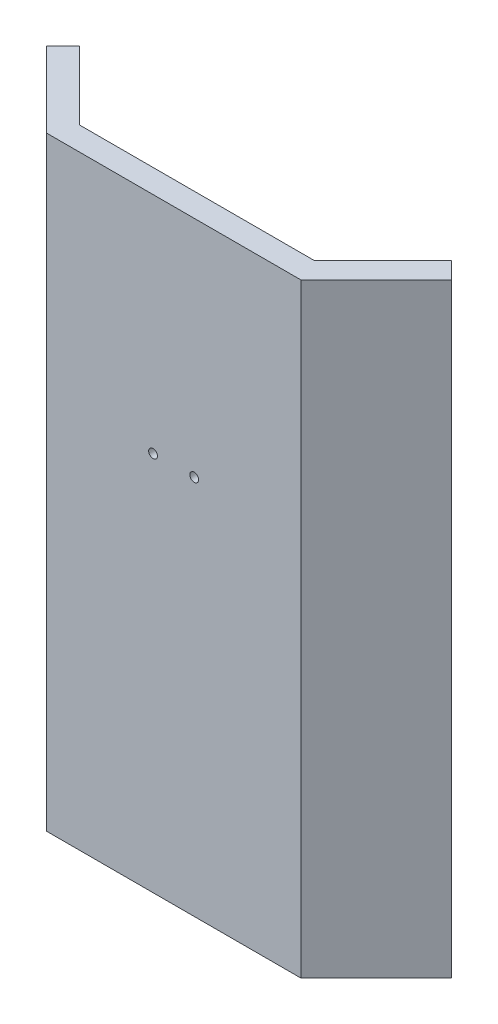
ISO-10303-21;
HEADER;
FILE_DESCRIPTION(('STEP AP214'),'2;1');
FILE_NAME('part.step','',(''),(''),'','','');
FILE_SCHEMA(('AUTOMOTIVE_DESIGN { 1 0 10303 214 1 1 1 1 }'));
ENDSEC;
DATA;
#1=APPLICATION_CONTEXT('core data for automotive mechanical design processes');
#2=APPLICATION_PROTOCOL_DEFINITION('international standard','automotive_design',2000,#1);
#3=PRODUCT_CONTEXT('',#1,'mechanical');
#4=PRODUCT('Part','Part','',(#3));
#5=PRODUCT_RELATED_PRODUCT_CATEGORY('part','',(#4));
#6=PRODUCT_DEFINITION_FORMATION('','',#4);
#7=PRODUCT_DEFINITION_CONTEXT('part definition',#1,'design');
#8=PRODUCT_DEFINITION('design','',#6,#7);
#9=PRODUCT_DEFINITION_SHAPE('','',#8);
#10=(LENGTH_UNIT() NAMED_UNIT(*) SI_UNIT(.MILLI.,.METRE.));
#11=(NAMED_UNIT(*) PLANE_ANGLE_UNIT() SI_UNIT($,.RADIAN.));
#12=(NAMED_UNIT(*) SI_UNIT($,.STERADIAN.) SOLID_ANGLE_UNIT());
#13=UNCERTAINTY_MEASURE_WITH_UNIT(LENGTH_MEASURE(1.E-05),#10,'distance_accuracy_value','');
#14=(GEOMETRIC_REPRESENTATION_CONTEXT(3) GLOBAL_UNCERTAINTY_ASSIGNED_CONTEXT((#13)) GLOBAL_UNIT_ASSIGNED_CONTEXT((#10,
#11,#12)) REPRESENTATION_CONTEXT('',''));
#15=CARTESIAN_POINT('',(0.,0.,0.));
#16=DIRECTION('',(0.,0.,1.));
#17=DIRECTION('',(1.,0.,0.));
#18=AXIS2_PLACEMENT_3D('',#15,#16,#17);
#19=CARTESIAN_POINT('',(-40.,206.,0.));
#20=DIRECTION('',(0.,0.,-1.));
#21=DIRECTION('',(-1.,0.,0.));
#22=AXIS2_PLACEMENT_3D('',#19,#20,#21);
#23=PLANE('',#22);
#24=CARTESIAN_POINT('',(6.99993142890758,129.596,0.));
#25=DIRECTION('',(0.,0.,-1.));
#26=DIRECTION('',(-1.,0.,0.));
#27=AXIS2_PLACEMENT_3D('',#24,#25,#26);
#28=CIRCLE('',#27,1.5);
#29=CARTESIAN_POINT('',(5.49993142890758,129.596,0.));
#30=VERTEX_POINT('',#29);
#31=EDGE_CURVE('E518',#30,#30,#28,.T.);
#32=ORIENTED_EDGE('',*,*,#31,.F.);
#33=EDGE_LOOP('',(#32));
#34=FACE_BOUND('',#33,.T.);
#35=CARTESIAN_POINT('',(-7.00006857109242,129.596,0.));
#36=DIRECTION('',(0.,0.,-1.));
#37=DIRECTION('',(-1.,0.,0.));
#38=AXIS2_PLACEMENT_3D('',#35,#36,#37);
#39=CIRCLE('',#38,1.5);
#40=CARTESIAN_POINT('',(-8.50006857109242,129.596,0.));
#41=VERTEX_POINT('',#40);
#42=EDGE_CURVE('E521',#41,#41,#39,.T.);
#43=ORIENTED_EDGE('',*,*,#42,.F.);
#44=EDGE_LOOP('',(#43));
#45=FACE_BOUND('',#44,.T.);
#46=DIRECTION('',(1.,0.,0.));
#47=VECTOR('',#46,1.);
#48=CARTESIAN_POINT('',(-40.,0.,0.));
#49=LINE('',#48,#47);
#50=CARTESIAN_POINT('',(-40.,0.,0.));
#51=VERTEX_POINT('',#50);
#52=CARTESIAN_POINT('',(40.,0.,0.));
#53=VERTEX_POINT('',#52);
#54=EDGE_CURVE('E235',#51,#53,#49,.T.);
#55=ORIENTED_EDGE('',*,*,#54,.F.);
#56=DIRECTION('',(0.,-1.,0.));
#57=VECTOR('',#56,1.);
#58=CARTESIAN_POINT('',(-40.,206.,0.));
#59=LINE('',#58,#57);
#60=CARTESIAN_POINT('',(-40.,206.,0.));
#61=VERTEX_POINT('',#60);
#62=EDGE_CURVE('E256',#61,#51,#59,.T.);
#63=ORIENTED_EDGE('',*,*,#62,.F.);
#64=DIRECTION('',(1.,0.,0.));
#65=VECTOR('',#64,1.);
#66=CARTESIAN_POINT('',(-40.,206.,0.));
#67=LINE('',#66,#65);
#68=CARTESIAN_POINT('',(40.,206.,0.));
#69=VERTEX_POINT('',#68);
#70=EDGE_CURVE('E213',#61,#69,#67,.T.);
#71=ORIENTED_EDGE('',*,*,#70,.T.);
#72=DIRECTION('',(0.,-1.,0.));
#73=VECTOR('',#72,1.);
#74=CARTESIAN_POINT('',(40.,206.,0.));
#75=LINE('',#74,#73);
#76=EDGE_CURVE('E254',#69,#53,#75,.T.);
#77=ORIENTED_EDGE('',*,*,#76,.T.);
#78=EDGE_LOOP('',(#55,#63,#71,#77));
#79=FACE_BOUND('',#78,.T.);
#80=DIRECTION('',(-1.,0.,0.));
#81=VECTOR('',#80,1.);
#82=CARTESIAN_POINT('',(34.,6.40410699156168,0.));
#83=LINE('',#82,#81);
#84=CARTESIAN_POINT('',(34.,6.40410699156168,0.));
#85=VERTEX_POINT('',#84);
#86=CARTESIAN_POINT('',(24.,6.40410699156168,0.));
#87=VERTEX_POINT('',#86);
#88=EDGE_CURVE('E175',#85,#87,#83,.T.);
#89=ORIENTED_EDGE('',*,*,#88,.F.);
#90=DIRECTION('',(0.,-1.,0.));
#91=VECTOR('',#90,1.);
#92=CARTESIAN_POINT('',(34.,6.40410699156168,0.));
#93=LINE('',#92,#91);
#94=CARTESIAN_POINT('',(34.,12.4041069915617,0.));
#95=VERTEX_POINT('',#94);
#96=EDGE_CURVE('E172',#95,#85,#93,.T.);
#97=ORIENTED_EDGE('',*,*,#96,.F.);
#98=DIRECTION('',(1.,0.,0.));
#99=VECTOR('',#98,1.);
#100=CARTESIAN_POINT('',(34.,12.4041069915617,0.));
#101=LINE('',#100,#99);
#102=CARTESIAN_POINT('',(24.,12.4041069915617,0.));
#103=VERTEX_POINT('',#102);
#104=EDGE_CURVE('E184',#103,#95,#101,.T.);
#105=ORIENTED_EDGE('',*,*,#104,.F.);
#106=DIRECTION('',(0.,1.,0.));
#107=VECTOR('',#106,1.);
#108=CARTESIAN_POINT('',(24.,6.40410699156168,0.));
#109=LINE('',#108,#107);
#110=EDGE_CURVE('E192',#87,#103,#109,.T.);
#111=ORIENTED_EDGE('',*,*,#110,.F.);
#112=EDGE_LOOP('',(#89,#97,#105,#111));
#113=FACE_BOUND('',#112,.T.);
#114=DIRECTION('',(0.,1.,0.));
#115=VECTOR('',#114,1.);
#116=CARTESIAN_POINT('',(-34.,6.40410699156168,0.));
#117=LINE('',#116,#115);
#118=CARTESIAN_POINT('',(-34.,6.40410699156168,0.));
#119=VERTEX_POINT('',#118);
#120=CARTESIAN_POINT('',(-34.,12.4041069915617,0.));
#121=VERTEX_POINT('',#120);
#122=EDGE_CURVE('E265',#119,#121,#117,.T.);
#123=ORIENTED_EDGE('',*,*,#122,.F.);
#124=DIRECTION('',(-1.,0.,0.));
#125=VECTOR('',#124,1.);
#126=CARTESIAN_POINT('',(-34.,6.40410699156168,0.));
#127=LINE('',#126,#125);
#128=CARTESIAN_POINT('',(-24.,6.40410699156168,0.));
#129=VERTEX_POINT('',#128);
#130=EDGE_CURVE('E170',#129,#119,#127,.T.);
#131=ORIENTED_EDGE('',*,*,#130,.F.);
#132=DIRECTION('',(0.,-1.,0.));
#133=VECTOR('',#132,1.);
#134=CARTESIAN_POINT('',(-24.,6.40410699156168,0.));
#135=LINE('',#134,#133);
#136=CARTESIAN_POINT('',(-24.,12.4041069915617,0.));
#137=VERTEX_POINT('',#136);
#138=EDGE_CURVE('E166',#137,#129,#135,.T.);
#139=ORIENTED_EDGE('',*,*,#138,.F.);
#140=DIRECTION('',(1.,0.,0.));
#141=VECTOR('',#140,1.);
#142=CARTESIAN_POINT('',(-34.,12.4041069915617,0.));
#143=LINE('',#142,#141);
#144=EDGE_CURVE('E280',#121,#137,#143,.T.);
#145=ORIENTED_EDGE('',*,*,#144,.F.);
#146=EDGE_LOOP('',(#123,#131,#139,#145));
#147=FACE_BOUND('',#146,.T.);
#148=ADVANCED_FACE('F32',(#34,#45,#79,#113,#147),#23,.T.);
#149=CARTESIAN_POINT('',(-43.3137084989847,206.,8.));
#150=DIRECTION('',(-0.707106781186544,0.,0.707106781186551));
#151=DIRECTION('',(0.707106781186551,0.,0.707106781186544));
#152=AXIS2_PLACEMENT_3D('',#149,#150,#151);
#153=PLANE('',#152);
#154=DIRECTION('',(-0.707106781186551,0.,-0.707106781186544));
#155=VECTOR('',#154,1.);
#156=CARTESIAN_POINT('',(-43.3137084989847,0.,8.));
#157=LINE('',#156,#155);
#158=CARTESIAN_POINT('',(-43.3137084989847,0.,8.));
#159=VERTEX_POINT('',#158);
#160=CARTESIAN_POINT('',(-68.9913780286486,0.,-17.6776695296635));
#161=VERTEX_POINT('',#160);
#162=EDGE_CURVE('E203',#159,#161,#157,.T.);
#163=ORIENTED_EDGE('',*,*,#162,.F.);
#164=DIRECTION('',(0.,-1.,0.));
#165=VECTOR('',#164,1.);
#166=CARTESIAN_POINT('',(-43.3137084989847,206.,8.));
#167=LINE('',#166,#165);
#168=CARTESIAN_POINT('',(-43.3137084989847,206.,8.));
#169=VERTEX_POINT('',#168);
#170=EDGE_CURVE('E11',#169,#159,#167,.T.);
#171=ORIENTED_EDGE('',*,*,#170,.F.);
#172=DIRECTION('',(-0.707106781186551,0.,-0.707106781186544));
#173=VECTOR('',#172,1.);
#174=CARTESIAN_POINT('',(-43.3137084989847,206.,8.));
#175=LINE('',#174,#173);
#176=CARTESIAN_POINT('',(-68.9913780286486,206.,-17.6776695296635));
#177=VERTEX_POINT('',#176);
#178=EDGE_CURVE('E204',#169,#177,#175,.T.);
#179=ORIENTED_EDGE('',*,*,#178,.T.);
#180=DIRECTION('',(0.,-1.,0.));
#181=VECTOR('',#180,1.);
#182=CARTESIAN_POINT('',(-68.9913780286486,206.,-17.6776695296635));
#183=LINE('',#182,#181);
#184=EDGE_CURVE('E226',#177,#161,#183,.T.);
#185=ORIENTED_EDGE('',*,*,#184,.T.);
#186=EDGE_LOOP('',(#163,#171,#179,#185));
#187=FACE_BOUND('',#186,.T.);
#188=ADVANCED_FACE('F34',(#187),#153,.T.);
#189=CARTESIAN_POINT('',(-43.3137084989847,206.,8.));
#190=DIRECTION('',(0.,0.,-1.));
#191=DIRECTION('',(-1.,0.,0.));
#192=AXIS2_PLACEMENT_3D('',#189,#190,#191);
#193=PLANE('',#192);
#194=CARTESIAN_POINT('',(6.99993142890758,129.596,8.));
#195=DIRECTION('',(0.,0.,1.));
#196=DIRECTION('',(1.,0.,0.));
#197=AXIS2_PLACEMENT_3D('',#194,#195,#196);
#198=CIRCLE('',#197,1.5);
#199=CARTESIAN_POINT('',(8.49993142890758,129.596,8.));
#200=VERTEX_POINT('',#199);
#201=EDGE_CURVE('E520',#200,#200,#198,.T.);
#202=ORIENTED_EDGE('',*,*,#201,.F.);
#203=EDGE_LOOP('',(#202));
#204=FACE_BOUND('',#203,.T.);
#205=CARTESIAN_POINT('',(-7.00006857109242,129.596,8.));
#206=DIRECTION('',(0.,0.,1.));
#207=DIRECTION('',(1.,0.,0.));
#208=AXIS2_PLACEMENT_3D('',#205,#206,#207);
#209=CIRCLE('',#208,1.5);
#210=CARTESIAN_POINT('',(-5.50006857109242,129.596,8.));
#211=VERTEX_POINT('',#210);
#212=EDGE_CURVE('E522',#211,#211,#209,.T.);
#213=ORIENTED_EDGE('',*,*,#212,.F.);
#214=EDGE_LOOP('',(#213));
#215=FACE_BOUND('',#214,.T.);
#216=DIRECTION('',(1.,0.,0.));
#217=VECTOR('',#216,1.);
#218=CARTESIAN_POINT('',(-43.3137084989847,0.,8.));
#219=LINE('',#218,#217);
#220=CARTESIAN_POINT('',(43.3137084989848,0.,8.));
#221=VERTEX_POINT('',#220);
#222=EDGE_CURVE('E208',#159,#221,#219,.T.);
#223=ORIENTED_EDGE('',*,*,#222,.T.);
#224=DIRECTION('',(0.,-1.,0.));
#225=VECTOR('',#224,1.);
#226=CARTESIAN_POINT('',(43.3137084989848,206.,8.));
#227=LINE('',#226,#225);
#228=CARTESIAN_POINT('',(43.3137084989848,206.,8.));
#229=VERTEX_POINT('',#228);
#230=EDGE_CURVE('E41',#229,#221,#227,.T.);
#231=ORIENTED_EDGE('',*,*,#230,.F.);
#232=DIRECTION('',(1.,0.,0.));
#233=VECTOR('',#232,1.);
#234=CARTESIAN_POINT('',(-43.3137084989847,206.,8.));
#235=LINE('',#234,#233);
#236=EDGE_CURVE('E224',#169,#229,#235,.T.);
#237=ORIENTED_EDGE('',*,*,#236,.F.);
#238=ORIENTED_EDGE('',*,*,#170,.T.);
#239=EDGE_LOOP('',(#223,#231,#237,#238));
#240=FACE_BOUND('',#239,.T.);
#241=ADVANCED_FACE('F306',(#204,#215,#240),#193,.F.);
#242=CARTESIAN_POINT('',(43.3137084989848,206.,8.));
#243=DIRECTION('',(-0.707106781186548,0.,-0.707106781186548));
#244=DIRECTION('',(-0.707106781186548,0.,0.707106781186548));
#245=AXIS2_PLACEMENT_3D('',#242,#243,#244);
#246=PLANE('',#245);
#247=DIRECTION('',(0.707106781186548,0.,-0.707106781186548));
#248=VECTOR('',#247,1.);
#249=CARTESIAN_POINT('',(43.3137084989848,0.,8.));
#250=LINE('',#249,#248);
#251=CARTESIAN_POINT('',(68.9913780286485,0.,-17.6776695296637));
#252=VERTEX_POINT('',#251);
#253=EDGE_CURVE('E244',#221,#252,#250,.T.);
#254=ORIENTED_EDGE('',*,*,#253,.T.);
#255=DIRECTION('',(0.,-1.,0.));
#256=VECTOR('',#255,1.);
#257=CARTESIAN_POINT('',(68.9913780286485,206.,-17.6776695296637));
#258=LINE('',#257,#256);
#259=CARTESIAN_POINT('',(68.9913780286485,206.,-17.6776695296637));
#260=VERTEX_POINT('',#259);
#261=EDGE_CURVE('E250',#260,#252,#258,.T.);
#262=ORIENTED_EDGE('',*,*,#261,.F.);
#263=DIRECTION('',(0.707106781186548,0.,-0.707106781186548));
#264=VECTOR('',#263,1.);
#265=CARTESIAN_POINT('',(43.3137084989848,206.,8.));
#266=LINE('',#265,#264);
#267=EDGE_CURVE('E222',#229,#260,#266,.T.);
#268=ORIENTED_EDGE('',*,*,#267,.F.);
#269=ORIENTED_EDGE('',*,*,#230,.T.);
#270=EDGE_LOOP('',(#254,#262,#268,#269));
#271=FACE_BOUND('',#270,.T.);
#272=ADVANCED_FACE('F353',(#271),#246,.F.);
#273=CARTESIAN_POINT('',(63.3345237791561,206.,-23.3345237791561));
#274=DIRECTION('',(0.707106781186546,0.,-0.707106781186549));
#275=DIRECTION('',(-0.707106781186549,0.,-0.707106781186546));
#276=AXIS2_PLACEMENT_3D('',#273,#274,#275);
#277=PLANE('',#276);
#278=DIRECTION('',(0.707106781186549,0.,0.707106781186546));
#279=VECTOR('',#278,1.);
#280=CARTESIAN_POINT('',(63.3345237791561,0.,-23.3345237791561));
#281=LINE('',#280,#279);
#282=CARTESIAN_POINT('',(63.3345237791561,0.,-23.3345237791561));
#283=VERTEX_POINT('',#282);
#284=EDGE_CURVE('E241',#283,#252,#281,.T.);
#285=ORIENTED_EDGE('',*,*,#284,.F.);
#286=DIRECTION('',(0.,-1.,0.));
#287=VECTOR('',#286,1.);
#288=CARTESIAN_POINT('',(63.3345237791561,206.,-23.3345237791561));
#289=LINE('',#288,#287);
#290=CARTESIAN_POINT('',(63.3345237791561,206.,-23.3345237791561));
#291=VERTEX_POINT('',#290);
#292=EDGE_CURVE('E252',#291,#283,#289,.T.);
#293=ORIENTED_EDGE('',*,*,#292,.F.);
#294=DIRECTION('',(0.707106781186549,0.,0.707106781186546));
#295=VECTOR('',#294,1.);
#296=CARTESIAN_POINT('',(63.3345237791561,206.,-23.3345237791561));
#297=LINE('',#296,#295);
#298=EDGE_CURVE('E219',#291,#260,#297,.T.);
#299=ORIENTED_EDGE('',*,*,#298,.T.);
#300=ORIENTED_EDGE('',*,*,#261,.T.);
#301=EDGE_LOOP('',(#285,#293,#299,#300));
#302=FACE_BOUND('',#301,.T.);
#303=ADVANCED_FACE('F348',(#302),#277,.T.);
#304=CARTESIAN_POINT('',(40.,206.,0.));
#305=DIRECTION('',(-0.707106781186547,0.,-0.707106781186548));
#306=DIRECTION('',(-0.707106781186548,0.,0.707106781186547));
#307=AXIS2_PLACEMENT_3D('',#304,#305,#306);
#308=PLANE('',#307);
#309=DIRECTION('',(0.707106781186548,0.,-0.707106781186547));
#310=VECTOR('',#309,1.);
#311=CARTESIAN_POINT('',(40.,0.,0.));
#312=LINE('',#311,#310);
#313=EDGE_CURVE('E238',#53,#283,#312,.T.);
#314=ORIENTED_EDGE('',*,*,#313,.F.);
#315=ORIENTED_EDGE('',*,*,#76,.F.);
#316=DIRECTION('',(0.707106781186548,0.,-0.707106781186547));
#317=VECTOR('',#316,1.);
#318=CARTESIAN_POINT('',(40.,206.,0.));
#319=LINE('',#318,#317);
#320=EDGE_CURVE('E216',#69,#291,#319,.T.);
#321=ORIENTED_EDGE('',*,*,#320,.T.);
#322=ORIENTED_EDGE('',*,*,#292,.T.);
#323=EDGE_LOOP('',(#314,#315,#321,#322));
#324=FACE_BOUND('',#323,.T.);
#325=ADVANCED_FACE('F312',(#324),#308,.T.);
#326=CARTESIAN_POINT('',(-40.,206.,0.));
#327=DIRECTION('',(-0.707106781186544,0.,0.707106781186551));
#328=DIRECTION('',(0.707106781186551,0.,0.707106781186544));
#329=AXIS2_PLACEMENT_3D('',#326,#327,#328);
#330=PLANE('',#329);
#331=DIRECTION('',(-0.707106781186551,0.,-0.707106781186544));
#332=VECTOR('',#331,1.);
#333=CARTESIAN_POINT('',(-40.,0.,0.));
#334=LINE('',#333,#332);
#335=CARTESIAN_POINT('',(-63.3345237791562,0.,-23.3345237791559));
#336=VERTEX_POINT('',#335);
#337=EDGE_CURVE('E232',#51,#336,#334,.T.);
#338=ORIENTED_EDGE('',*,*,#337,.T.);
#339=DIRECTION('',(0.,-1.,0.));
#340=VECTOR('',#339,1.);
#341=CARTESIAN_POINT('',(-63.3345237791562,206.,-23.3345237791559));
#342=LINE('',#341,#340);
#343=CARTESIAN_POINT('',(-63.3345237791562,206.,-23.3345237791559));
#344=VERTEX_POINT('',#343);
#345=EDGE_CURVE('E258',#344,#336,#342,.T.);
#346=ORIENTED_EDGE('',*,*,#345,.F.);
#347=DIRECTION('',(-0.707106781186551,0.,-0.707106781186544));
#348=VECTOR('',#347,1.);
#349=CARTESIAN_POINT('',(-40.,206.,0.));
#350=LINE('',#349,#348);
#351=EDGE_CURVE('E211',#61,#344,#350,.T.);
#352=ORIENTED_EDGE('',*,*,#351,.F.);
#353=ORIENTED_EDGE('',*,*,#62,.T.);
#354=EDGE_LOOP('',(#338,#346,#352,#353));
#355=FACE_BOUND('',#354,.T.);
#356=ADVANCED_FACE('F314',(#355),#330,.F.);
#357=CARTESIAN_POINT('',(-68.9913780286486,206.,-17.6776695296635));
#358=DIRECTION('',(-0.707106781186551,0.,-0.707106781186543));
#359=DIRECTION('',(-0.707106781186544,0.,0.707106781186552));
#360=AXIS2_PLACEMENT_3D('',#357,#358,#359);
#361=PLANE('',#360);
#362=DIRECTION('',(0.707106781186544,0.,-0.707106781186551));
#363=VECTOR('',#362,1.);
#364=CARTESIAN_POINT('',(-68.9913780286486,0.,-17.6776695296635));
#365=LINE('',#364,#363);
#366=EDGE_CURVE('E229',#161,#336,#365,.T.);
#367=ORIENTED_EDGE('',*,*,#366,.F.);
#368=ORIENTED_EDGE('',*,*,#184,.F.);
#369=DIRECTION('',(0.707106781186544,0.,-0.707106781186551));
#370=VECTOR('',#369,1.);
#371=CARTESIAN_POINT('',(-68.9913780286486,206.,-17.6776695296635));
#372=LINE('',#371,#370);
#373=EDGE_CURVE('E207',#177,#344,#372,.T.);
#374=ORIENTED_EDGE('',*,*,#373,.T.);
#375=ORIENTED_EDGE('',*,*,#345,.T.);
#376=EDGE_LOOP('',(#367,#368,#374,#375));
#377=FACE_BOUND('',#376,.T.);
#378=ADVANCED_FACE('F316',(#377),#361,.T.);
#379=CARTESIAN_POINT('',(0.,206.,0.));
#380=DIRECTION('',(0.,-1.,0.));
#381=DIRECTION('',(0.,0.,-1.));
#382=AXIS2_PLACEMENT_3D('',#379,#380,#381);
#383=PLANE('',#382);
#384=ORIENTED_EDGE('',*,*,#178,.F.);
#385=ORIENTED_EDGE('',*,*,#236,.T.);
#386=ORIENTED_EDGE('',*,*,#267,.T.);
#387=ORIENTED_EDGE('',*,*,#298,.F.);
#388=ORIENTED_EDGE('',*,*,#320,.F.);
#389=ORIENTED_EDGE('',*,*,#70,.F.);
#390=ORIENTED_EDGE('',*,*,#351,.T.);
#391=ORIENTED_EDGE('',*,*,#373,.F.);
#392=EDGE_LOOP('',(#384,#385,#386,#387,#388,#389,#390,#391));
#393=FACE_BOUND('',#392,.T.);
#394=ADVANCED_FACE('F319',(#393),#383,.F.);
#395=CARTESIAN_POINT('',(0.,0.,0.));
#396=DIRECTION('',(0.,-1.,0.));
#397=DIRECTION('',(0.,0.,-1.));
#398=AXIS2_PLACEMENT_3D('',#395,#396,#397);
#399=PLANE('',#398);
#400=ORIENTED_EDGE('',*,*,#162,.T.);
#401=ORIENTED_EDGE('',*,*,#366,.T.);
#402=ORIENTED_EDGE('',*,*,#337,.F.);
#403=ORIENTED_EDGE('',*,*,#54,.T.);
#404=ORIENTED_EDGE('',*,*,#313,.T.);
#405=ORIENTED_EDGE('',*,*,#284,.T.);
#406=ORIENTED_EDGE('',*,*,#253,.F.);
#407=ORIENTED_EDGE('',*,*,#222,.F.);
#408=EDGE_LOOP('',(#400,#401,#402,#403,#404,#405,#406,#407));
#409=FACE_BOUND('',#408,.T.);
#410=ADVANCED_FACE('F324',(#409),#399,.T.);
#411=CARTESIAN_POINT('',(34.,6.40410699156168,-10.));
#412=DIRECTION('',(-1.,0.,0.));
#413=DIRECTION('',(0.,0.,1.));
#414=AXIS2_PLACEMENT_3D('',#411,#412,#413);
#415=PLANE('',#414);
#416=ORIENTED_EDGE('',*,*,#96,.T.);
#417=DIRECTION('',(0.,0.,1.));
#418=VECTOR('',#417,1.);
#419=CARTESIAN_POINT('',(34.,6.40410699156168,-10.));
#420=LINE('',#419,#418);
#421=CARTESIAN_POINT('',(34.,6.40410699156168,-10.));
#422=VERTEX_POINT('',#421);
#423=EDGE_CURVE('E201',#422,#85,#420,.T.);
#424=ORIENTED_EDGE('',*,*,#423,.F.);
#425=DIRECTION('',(0.,-1.,0.));
#426=VECTOR('',#425,1.);
#427=CARTESIAN_POINT('',(34.,6.40410699156168,-10.));
#428=LINE('',#427,#426);
#429=CARTESIAN_POINT('',(34.,12.4041069915617,-10.));
#430=VERTEX_POINT('',#429);
#431=EDGE_CURVE('E180',#430,#422,#428,.T.);
#432=ORIENTED_EDGE('',*,*,#431,.F.);
#433=DIRECTION('',(0.,0.,1.));
#434=VECTOR('',#433,1.);
#435=CARTESIAN_POINT('',(34.,12.4041069915617,-10.));
#436=LINE('',#435,#434);
#437=EDGE_CURVE('E189',#430,#95,#436,.T.);
#438=ORIENTED_EDGE('',*,*,#437,.T.);
#439=EDGE_LOOP('',(#416,#424,#432,#438));
#440=FACE_BOUND('',#439,.T.);
#441=ADVANCED_FACE('F394',(#440),#415,.F.);
#442=CARTESIAN_POINT('',(34.,6.40410699156168,-10.));
#443=DIRECTION('',(0.,1.,0.));
#444=DIRECTION('',(0.,0.,1.));
#445=AXIS2_PLACEMENT_3D('',#442,#443,#444);
#446=PLANE('',#445);
#447=CARTESIAN_POINT('',(29.,6.40410699156168,-5.));
#448=DIRECTION('',(0.,-1.,0.));
#449=DIRECTION('',(0.,0.,-1.));
#450=AXIS2_PLACEMENT_3D('',#447,#448,#449);
#451=CIRCLE('',#450,1.5);
#452=CARTESIAN_POINT('',(29.,6.40410699156168,-6.5));
#453=VERTEX_POINT('',#452);
#454=EDGE_CURVE('E272',#453,#453,#451,.T.);
#455=ORIENTED_EDGE('',*,*,#454,.F.);
#456=EDGE_LOOP('',(#455));
#457=FACE_BOUND('',#456,.T.);
#458=ORIENTED_EDGE('',*,*,#88,.T.);
#459=DIRECTION('',(0.,0.,1.));
#460=VECTOR('',#459,1.);
#461=CARTESIAN_POINT('',(24.,6.40410699156168,-10.));
#462=LINE('',#461,#460);
#463=CARTESIAN_POINT('',(24.,6.40410699156168,-10.));
#464=VERTEX_POINT('',#463);
#465=EDGE_CURVE('E198',#464,#87,#462,.T.);
#466=ORIENTED_EDGE('',*,*,#465,.F.);
#467=DIRECTION('',(-1.,0.,0.));
#468=VECTOR('',#467,1.);
#469=CARTESIAN_POINT('',(34.,6.40410699156168,-10.));
#470=LINE('',#469,#468);
#471=EDGE_CURVE('E183',#422,#464,#470,.T.);
#472=ORIENTED_EDGE('',*,*,#471,.F.);
#473=ORIENTED_EDGE('',*,*,#423,.T.);
#474=EDGE_LOOP('',(#458,#466,#472,#473));
#475=FACE_BOUND('',#474,.T.);
#476=ADVANCED_FACE('F403',(#457,#475),#446,.F.);
#477=CARTESIAN_POINT('',(24.,6.40410699156168,-10.));
#478=DIRECTION('',(1.,0.,0.));
#479=DIRECTION('',(0.,0.,-1.));
#480=AXIS2_PLACEMENT_3D('',#477,#478,#479);
#481=PLANE('',#480);
#482=ORIENTED_EDGE('',*,*,#110,.T.);
#483=DIRECTION('',(0.,0.,1.));
#484=VECTOR('',#483,1.);
#485=CARTESIAN_POINT('',(24.,12.4041069915617,-10.));
#486=LINE('',#485,#484);
#487=CARTESIAN_POINT('',(24.,12.4041069915617,-10.));
#488=VERTEX_POINT('',#487);
#489=EDGE_CURVE('E57',#488,#103,#486,.T.);
#490=ORIENTED_EDGE('',*,*,#489,.F.);
#491=DIRECTION('',(0.,1.,0.));
#492=VECTOR('',#491,1.);
#493=CARTESIAN_POINT('',(24.,6.40410699156168,-10.));
#494=LINE('',#493,#492);
#495=EDGE_CURVE('E186',#464,#488,#494,.T.);
#496=ORIENTED_EDGE('',*,*,#495,.F.);
#497=ORIENTED_EDGE('',*,*,#465,.T.);
#498=EDGE_LOOP('',(#482,#490,#496,#497));
#499=FACE_BOUND('',#498,.T.);
#500=ADVANCED_FACE('F411',(#499),#481,.F.);
#501=CARTESIAN_POINT('',(34.,12.4041069915617,-10.));
#502=DIRECTION('',(0.,-1.,0.));
#503=DIRECTION('',(0.,0.,-1.));
#504=AXIS2_PLACEMENT_3D('',#501,#502,#503);
#505=PLANE('',#504);
#506=CARTESIAN_POINT('',(29.,12.4041069915617,-5.));
#507=DIRECTION('',(0.,-1.,0.));
#508=DIRECTION('',(0.,0.,-1.));
#509=AXIS2_PLACEMENT_3D('',#506,#507,#508);
#510=CIRCLE('',#509,1.5);
#511=CARTESIAN_POINT('',(29.,12.4041069915617,-6.5));
#512=VERTEX_POINT('',#511);
#513=EDGE_CURVE('E36',#512,#512,#510,.T.);
#514=ORIENTED_EDGE('',*,*,#513,.T.);
#515=EDGE_LOOP('',(#514));
#516=FACE_BOUND('',#515,.T.);
#517=ORIENTED_EDGE('',*,*,#104,.T.);
#518=ORIENTED_EDGE('',*,*,#437,.F.);
#519=DIRECTION('',(1.,0.,0.));
#520=VECTOR('',#519,1.);
#521=CARTESIAN_POINT('',(34.,12.4041069915617,-10.));
#522=LINE('',#521,#520);
#523=EDGE_CURVE('E188',#488,#430,#522,.T.);
#524=ORIENTED_EDGE('',*,*,#523,.F.);
#525=ORIENTED_EDGE('',*,*,#489,.T.);
#526=EDGE_LOOP('',(#517,#518,#524,#525));
#527=FACE_BOUND('',#526,.T.);
#528=ADVANCED_FACE('F416',(#516,#527),#505,.F.);
#529=CARTESIAN_POINT('',(0.,0.,-10.));
#530=DIRECTION('',(0.,0.,1.));
#531=DIRECTION('',(1.,0.,0.));
#532=AXIS2_PLACEMENT_3D('',#529,#530,#531);
#533=PLANE('',#532);
#534=ORIENTED_EDGE('',*,*,#431,.T.);
#535=ORIENTED_EDGE('',*,*,#471,.T.);
#536=ORIENTED_EDGE('',*,*,#495,.T.);
#537=ORIENTED_EDGE('',*,*,#523,.T.);
#538=EDGE_LOOP('',(#534,#535,#536,#537));
#539=FACE_BOUND('',#538,.T.);
#540=ADVANCED_FACE('F424',(#539),#533,.F.);
#541=CARTESIAN_POINT('',(-34.,6.40410699156168,-10.));
#542=DIRECTION('',(0.,1.,0.));
#543=DIRECTION('',(0.,0.,1.));
#544=AXIS2_PLACEMENT_3D('',#541,#542,#543);
#545=PLANE('',#544);
#546=CARTESIAN_POINT('',(-29.,6.40410699156168,-5.));
#547=DIRECTION('',(0.,-1.,0.));
#548=DIRECTION('',(0.,0.,-1.));
#549=AXIS2_PLACEMENT_3D('',#546,#547,#548);
#550=CIRCLE('',#549,1.5);
#551=CARTESIAN_POINT('',(-29.,6.40410699156168,-6.5));
#552=VERTEX_POINT('',#551);
#553=EDGE_CURVE('E262',#552,#552,#550,.T.);
#554=ORIENTED_EDGE('',*,*,#553,.F.);
#555=EDGE_LOOP('',(#554));
#556=FACE_BOUND('',#555,.T.);
#557=ORIENTED_EDGE('',*,*,#130,.T.);
#558=DIRECTION('',(0.,0.,1.));
#559=VECTOR('',#558,1.);
#560=CARTESIAN_POINT('',(-34.,6.40410699156168,-10.));
#561=LINE('',#560,#559);
#562=CARTESIAN_POINT('',(-34.,6.40410699156168,-10.));
#563=VERTEX_POINT('',#562);
#564=EDGE_CURVE('E151',#563,#119,#561,.T.);
#565=ORIENTED_EDGE('',*,*,#564,.F.);
#566=DIRECTION('',(-1.,0.,0.));
#567=VECTOR('',#566,1.);
#568=CARTESIAN_POINT('',(-34.,6.40410699156168,-10.));
#569=LINE('',#568,#567);
#570=CARTESIAN_POINT('',(-24.,6.40410699156168,-10.));
#571=VERTEX_POINT('',#570);
#572=EDGE_CURVE('E158',#571,#563,#569,.T.);
#573=ORIENTED_EDGE('',*,*,#572,.F.);
#574=DIRECTION('',(0.,0.,1.));
#575=VECTOR('',#574,1.);
#576=CARTESIAN_POINT('',(-24.,6.40410699156168,-10.));
#577=LINE('',#576,#575);
#578=EDGE_CURVE('E277',#571,#129,#577,.T.);
#579=ORIENTED_EDGE('',*,*,#578,.T.);
#580=EDGE_LOOP('',(#557,#565,#573,#579));
#581=FACE_BOUND('',#580,.T.);
#582=ADVANCED_FACE('F168',(#556,#581),#545,.F.);
#583=CARTESIAN_POINT('',(-34.,6.40410699156168,-10.));
#584=DIRECTION('',(1.,0.,0.));
#585=DIRECTION('',(0.,0.,-1.));
#586=AXIS2_PLACEMENT_3D('',#583,#584,#585);
#587=PLANE('',#586);
#588=ORIENTED_EDGE('',*,*,#122,.T.);
#589=DIRECTION('',(0.,0.,1.));
#590=VECTOR('',#589,1.);
#591=CARTESIAN_POINT('',(-34.,12.4041069915617,-10.));
#592=LINE('',#591,#590);
#593=CARTESIAN_POINT('',(-34.,12.4041069915617,-10.));
#594=VERTEX_POINT('',#593);
#595=EDGE_CURVE('E154',#594,#121,#592,.T.);
#596=ORIENTED_EDGE('',*,*,#595,.F.);
#597=DIRECTION('',(0.,1.,0.));
#598=VECTOR('',#597,1.);
#599=CARTESIAN_POINT('',(-34.,6.40410699156168,-10.));
#600=LINE('',#599,#598);
#601=EDGE_CURVE('E147',#563,#594,#600,.T.);
#602=ORIENTED_EDGE('',*,*,#601,.F.);
#603=ORIENTED_EDGE('',*,*,#564,.T.);
#604=EDGE_LOOP('',(#588,#596,#602,#603));
#605=FACE_BOUND('',#604,.T.);
#606=ADVANCED_FACE('F149',(#605),#587,.F.);
#607=CARTESIAN_POINT('',(-34.,12.4041069915617,-10.));
#608=DIRECTION('',(0.,-1.,0.));
#609=DIRECTION('',(0.,0.,-1.));
#610=AXIS2_PLACEMENT_3D('',#607,#608,#609);
#611=PLANE('',#610);
#612=CARTESIAN_POINT('',(-29.,12.4041069915617,-5.));
#613=DIRECTION('',(0.,-1.,0.));
#614=DIRECTION('',(0.,0.,-1.));
#615=AXIS2_PLACEMENT_3D('',#612,#613,#614);
#616=CIRCLE('',#615,1.5);
#617=CARTESIAN_POINT('',(-29.,12.4041069915617,-6.5));
#618=VERTEX_POINT('',#617);
#619=EDGE_CURVE('E260',#618,#618,#616,.T.);
#620=ORIENTED_EDGE('',*,*,#619,.T.);
#621=EDGE_LOOP('',(#620));
#622=FACE_BOUND('',#621,.T.);
#623=ORIENTED_EDGE('',*,*,#144,.T.);
#624=DIRECTION('',(0.,0.,1.));
#625=VECTOR('',#624,1.);
#626=CARTESIAN_POINT('',(-24.,12.4041069915617,-10.));
#627=LINE('',#626,#625);
#628=CARTESIAN_POINT('',(-24.,12.4041069915617,-10.));
#629=VERTEX_POINT('',#628);
#630=EDGE_CURVE('E49',#629,#137,#627,.T.);
#631=ORIENTED_EDGE('',*,*,#630,.F.);
#632=DIRECTION('',(1.,0.,0.));
#633=VECTOR('',#632,1.);
#634=CARTESIAN_POINT('',(-34.,12.4041069915617,-10.));
#635=LINE('',#634,#633);
#636=EDGE_CURVE('E157',#594,#629,#635,.T.);
#637=ORIENTED_EDGE('',*,*,#636,.F.);
#638=ORIENTED_EDGE('',*,*,#595,.T.);
#639=EDGE_LOOP('',(#623,#631,#637,#638));
#640=FACE_BOUND('',#639,.T.);
#641=ADVANCED_FACE('F287',(#622,#640),#611,.F.);
#642=CARTESIAN_POINT('',(-24.,6.40410699156168,-10.));
#643=DIRECTION('',(-1.,0.,0.));
#644=DIRECTION('',(0.,0.,1.));
#645=AXIS2_PLACEMENT_3D('',#642,#643,#644);
#646=PLANE('',#645);
#647=ORIENTED_EDGE('',*,*,#138,.T.);
#648=ORIENTED_EDGE('',*,*,#578,.F.);
#649=DIRECTION('',(0.,-1.,0.));
#650=VECTOR('',#649,1.);
#651=CARTESIAN_POINT('',(-24.,6.40410699156168,-10.));
#652=LINE('',#651,#650);
#653=EDGE_CURVE('E162',#629,#571,#652,.T.);
#654=ORIENTED_EDGE('',*,*,#653,.F.);
#655=ORIENTED_EDGE('',*,*,#630,.T.);
#656=EDGE_LOOP('',(#647,#648,#654,#655));
#657=FACE_BOUND('',#656,.T.);
#658=ADVANCED_FACE('F288',(#657),#646,.F.);
#659=CARTESIAN_POINT('',(0.,0.,-10.));
#660=DIRECTION('',(0.,0.,1.));
#661=DIRECTION('',(1.,0.,0.));
#662=AXIS2_PLACEMENT_3D('',#659,#660,#661);
#663=PLANE('',#662);
#664=ORIENTED_EDGE('',*,*,#572,.T.);
#665=ORIENTED_EDGE('',*,*,#601,.T.);
#666=ORIENTED_EDGE('',*,*,#636,.T.);
#667=ORIENTED_EDGE('',*,*,#653,.T.);
#668=EDGE_LOOP('',(#664,#665,#666,#667));
#669=FACE_BOUND('',#668,.T.);
#670=ADVANCED_FACE('F161',(#669),#663,.F.);
#671=CARTESIAN_POINT('',(-29.,16.4041069915617,-5.));
#672=DIRECTION('',(0.,-1.,0.));
#673=DIRECTION('',(0.,0.,-1.));
#674=AXIS2_PLACEMENT_3D('',#671,#672,#673);
#675=CYLINDRICAL_SURFACE('',#674,1.5);
#676=ORIENTED_EDGE('',*,*,#553,.T.);
#677=EDGE_LOOP('',(#676));
#678=FACE_BOUND('',#677,.T.);
#679=ORIENTED_EDGE('',*,*,#619,.F.);
#680=EDGE_LOOP('',(#679));
#681=FACE_BOUND('',#680,.T.);
#682=ADVANCED_FACE('F295',(#678,#681),#675,.F.);
#683=CARTESIAN_POINT('',(29.,16.4041069915617,-5.));
#684=DIRECTION('',(0.,-1.,0.));
#685=DIRECTION('',(0.,0.,-1.));
#686=AXIS2_PLACEMENT_3D('',#683,#684,#685);
#687=CYLINDRICAL_SURFACE('',#686,1.5);
#688=ORIENTED_EDGE('',*,*,#454,.T.);
#689=EDGE_LOOP('',(#688));
#690=FACE_BOUND('',#689,.T.);
#691=ORIENTED_EDGE('',*,*,#513,.F.);
#692=EDGE_LOOP('',(#691));
#693=FACE_BOUND('',#692,.T.);
#694=ADVANCED_FACE('F484',(#690,#693),#687,.F.);
#695=CARTESIAN_POINT('',(-7.00006857109242,129.596,-2.));
#696=DIRECTION('',(0.,0.,1.));
#697=DIRECTION('',(1.,0.,0.));
#698=AXIS2_PLACEMENT_3D('',#695,#696,#697);
#699=CYLINDRICAL_SURFACE('',#698,1.5);
#700=ORIENTED_EDGE('',*,*,#42,.T.);
#701=EDGE_LOOP('',(#700));
#702=FACE_BOUND('',#701,.T.);
#703=ORIENTED_EDGE('',*,*,#212,.T.);
#704=EDGE_LOOP('',(#703));
#705=FACE_BOUND('',#704,.T.);
#706=ADVANCED_FACE('F492',(#702,#705),#699,.F.);
#707=CARTESIAN_POINT('',(6.99993142890758,129.596,-2.));
#708=DIRECTION('',(0.,0.,1.));
#709=DIRECTION('',(1.,0.,0.));
#710=AXIS2_PLACEMENT_3D('',#707,#708,#709);
#711=CYLINDRICAL_SURFACE('',#710,1.5);
#712=ORIENTED_EDGE('',*,*,#31,.T.);
#713=EDGE_LOOP('',(#712));
#714=FACE_BOUND('',#713,.T.);
#715=ORIENTED_EDGE('',*,*,#201,.T.);
#716=EDGE_LOOP('',(#715));
#717=FACE_BOUND('',#716,.T.);
#718=ADVANCED_FACE('F502',(#714,#717),#711,.F.);
#719=CLOSED_SHELL('',(#148,#188,#241,#272,#303,#325,#356,#378,#394,#410,#441,#476,#500,#528,
#540,#582,#606,#641,#658,#670,#682,#694,#706,#718));
#720=MANIFOLD_SOLID_BREP('B2',#719);
#721=ADVANCED_BREP_SHAPE_REPRESENTATION('',(#18,#720),#14);
#722=SHAPE_DEFINITION_REPRESENTATION(#9,#721);
ENDSEC;
END-ISO-10303-21;
